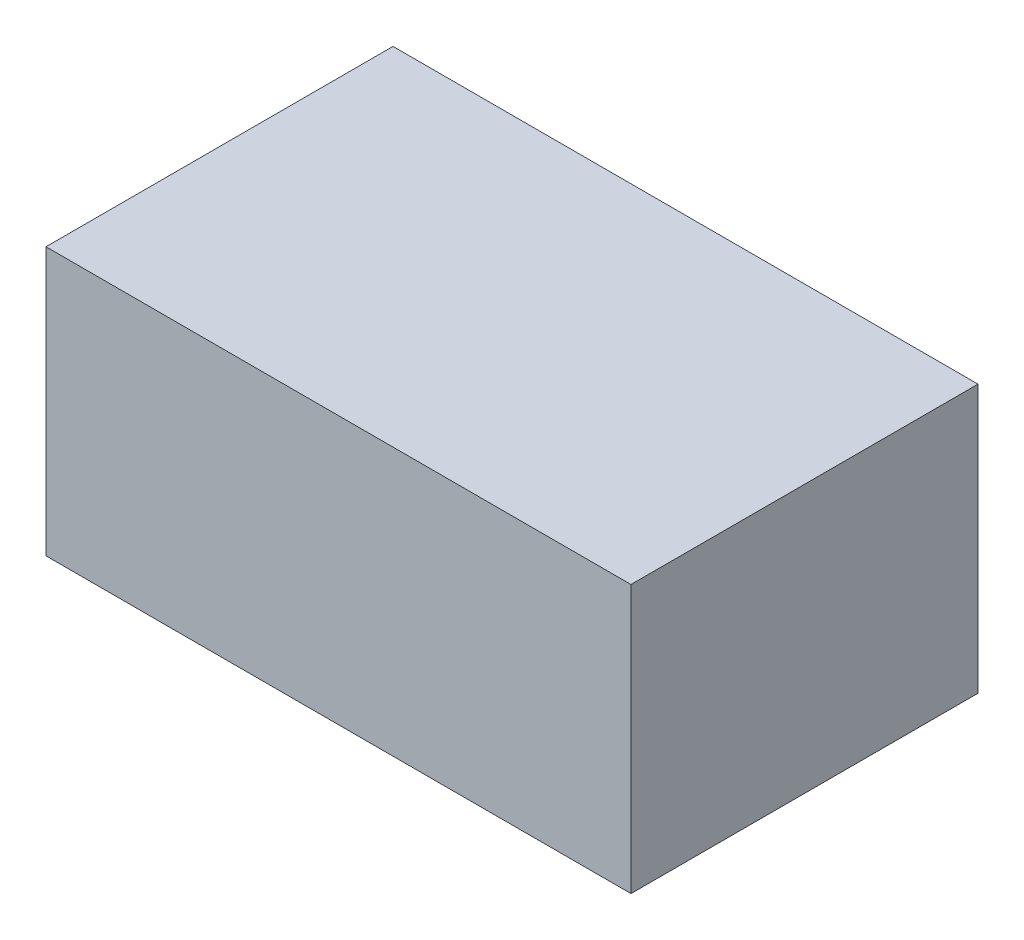
ISO-10303-21;
HEADER;
FILE_DESCRIPTION(('STEP AP214'),'2;1');
FILE_NAME('part.step','',(''),(''),'','','');
FILE_SCHEMA(('AUTOMOTIVE_DESIGN { 1 0 10303 214 1 1 1 1 }'));
ENDSEC;
DATA;
#1=APPLICATION_CONTEXT('core data for automotive mechanical design processes');
#2=APPLICATION_PROTOCOL_DEFINITION('international standard','automotive_design',2000,#1);
#3=PRODUCT_CONTEXT('',#1,'mechanical');
#4=PRODUCT('Part','Part','',(#3));
#5=PRODUCT_RELATED_PRODUCT_CATEGORY('part','',(#4));
#6=PRODUCT_DEFINITION_FORMATION('','',#4);
#7=PRODUCT_DEFINITION_CONTEXT('part definition',#1,'design');
#8=PRODUCT_DEFINITION('design','',#6,#7);
#9=PRODUCT_DEFINITION_SHAPE('','',#8);
#10=(LENGTH_UNIT() NAMED_UNIT(*) SI_UNIT(.MILLI.,.METRE.));
#11=(NAMED_UNIT(*) PLANE_ANGLE_UNIT() SI_UNIT($,.RADIAN.));
#12=(NAMED_UNIT(*) SI_UNIT($,.STERADIAN.) SOLID_ANGLE_UNIT());
#13=UNCERTAINTY_MEASURE_WITH_UNIT(LENGTH_MEASURE(1.E-05),#10,'distance_accuracy_value','');
#14=(GEOMETRIC_REPRESENTATION_CONTEXT(3) GLOBAL_UNCERTAINTY_ASSIGNED_CONTEXT((#13)) GLOBAL_UNIT_ASSIGNED_CONTEXT((#10,
#11,#12)) REPRESENTATION_CONTEXT('',''));
#15=CARTESIAN_POINT('',(0.,0.,0.));
#16=DIRECTION('',(0.,0.,1.));
#17=DIRECTION('',(1.,0.,0.));
#18=AXIS2_PLACEMENT_3D('',#15,#16,#17);
#19=CARTESIAN_POINT('',(29.5,13.5,35.));
#20=DIRECTION('',(-1.,0.,0.));
#21=DIRECTION('',(0.,-1.,0.));
#22=AXIS2_PLACEMENT_3D('',#19,#20,#21);
#23=PLANE('',#22);
#24=DIRECTION('',(0.,1.,0.));
#25=VECTOR('',#24,1.);
#26=CARTESIAN_POINT('',(29.5,13.5,0.));
#27=LINE('',#26,#25);
#28=CARTESIAN_POINT('',(29.5,-13.5,0.));
#29=VERTEX_POINT('',#28);
#30=CARTESIAN_POINT('',(29.5,13.5,0.));
#31=VERTEX_POINT('',#30);
#32=EDGE_CURVE('E110',#29,#31,#27,.T.);
#33=ORIENTED_EDGE('',*,*,#32,.T.);
#34=DIRECTION('',(0.,0.,-1.));
#35=VECTOR('',#34,1.);
#36=CARTESIAN_POINT('',(29.5,13.5,35.));
#37=LINE('',#36,#35);
#38=CARTESIAN_POINT('',(29.5,13.5,35.));
#39=VERTEX_POINT('',#38);
#40=EDGE_CURVE('E11',#39,#31,#37,.T.);
#41=ORIENTED_EDGE('',*,*,#40,.F.);
#42=DIRECTION('',(0.,1.,0.));
#43=VECTOR('',#42,1.);
#44=CARTESIAN_POINT('',(29.5,13.5,35.));
#45=LINE('',#44,#43);
#46=CARTESIAN_POINT('',(29.5,-13.5,35.));
#47=VERTEX_POINT('',#46);
#48=EDGE_CURVE('E94',#47,#39,#45,.T.);
#49=ORIENTED_EDGE('',*,*,#48,.F.);
#50=DIRECTION('',(0.,0.,-1.));
#51=VECTOR('',#50,1.);
#52=CARTESIAN_POINT('',(29.5,-13.5,35.));
#53=LINE('',#52,#51);
#54=EDGE_CURVE('E106',#47,#29,#53,.T.);
#55=ORIENTED_EDGE('',*,*,#54,.T.);
#56=EDGE_LOOP('',(#33,#41,#49,#55));
#57=FACE_BOUND('',#56,.T.);
#58=ADVANCED_FACE('F42',(#57),#23,.F.);
#59=CARTESIAN_POINT('',(-29.5,13.5,35.));
#60=DIRECTION('',(0.,-1.,0.));
#61=DIRECTION('',(0.,0.,-1.));
#62=AXIS2_PLACEMENT_3D('',#59,#60,#61);
#63=PLANE('',#62);
#64=DIRECTION('',(-1.,0.,0.));
#65=VECTOR('',#64,1.);
#66=CARTESIAN_POINT('',(-29.5,13.5,0.));
#67=LINE('',#66,#65);
#68=CARTESIAN_POINT('',(-29.5,13.5,0.));
#69=VERTEX_POINT('',#68);
#70=EDGE_CURVE('E99',#31,#69,#67,.T.);
#71=ORIENTED_EDGE('',*,*,#70,.T.);
#72=DIRECTION('',(0.,0.,-1.));
#73=VECTOR('',#72,1.);
#74=CARTESIAN_POINT('',(-29.5,13.5,35.));
#75=LINE('',#74,#73);
#76=CARTESIAN_POINT('',(-29.5,13.5,35.));
#77=VERTEX_POINT('',#76);
#78=EDGE_CURVE('E51',#77,#69,#75,.T.);
#79=ORIENTED_EDGE('',*,*,#78,.F.);
#80=DIRECTION('',(-1.,0.,0.));
#81=VECTOR('',#80,1.);
#82=CARTESIAN_POINT('',(-29.5,13.5,35.));
#83=LINE('',#82,#81);
#84=EDGE_CURVE('E89',#39,#77,#83,.T.);
#85=ORIENTED_EDGE('',*,*,#84,.F.);
#86=ORIENTED_EDGE('',*,*,#40,.T.);
#87=EDGE_LOOP('',(#71,#79,#85,#86));
#88=FACE_BOUND('',#87,.T.);
#89=ADVANCED_FACE('F98',(#88),#63,.F.);
#90=CARTESIAN_POINT('',(-29.5,13.5,35.));
#91=DIRECTION('',(1.,0.,0.));
#92=DIRECTION('',(0.,1.,0.));
#93=AXIS2_PLACEMENT_3D('',#90,#91,#92);
#94=PLANE('',#93);
#95=DIRECTION('',(0.,-1.,0.));
#96=VECTOR('',#95,1.);
#97=CARTESIAN_POINT('',(-29.5,13.5,0.));
#98=LINE('',#97,#96);
#99=CARTESIAN_POINT('',(-29.5,-13.5,0.));
#100=VERTEX_POINT('',#99);
#101=EDGE_CURVE('E76',#69,#100,#98,.T.);
#102=ORIENTED_EDGE('',*,*,#101,.T.);
#103=DIRECTION('',(0.,0.,-1.));
#104=VECTOR('',#103,1.);
#105=CARTESIAN_POINT('',(-29.5,-13.5,35.));
#106=LINE('',#105,#104);
#107=CARTESIAN_POINT('',(-29.5,-13.5,35.));
#108=VERTEX_POINT('',#107);
#109=EDGE_CURVE('E101',#108,#100,#106,.T.);
#110=ORIENTED_EDGE('',*,*,#109,.F.);
#111=DIRECTION('',(0.,-1.,0.));
#112=VECTOR('',#111,1.);
#113=CARTESIAN_POINT('',(-29.5,13.5,35.));
#114=LINE('',#113,#112);
#115=EDGE_CURVE('E92',#77,#108,#114,.T.);
#116=ORIENTED_EDGE('',*,*,#115,.F.);
#117=ORIENTED_EDGE('',*,*,#78,.T.);
#118=EDGE_LOOP('',(#102,#110,#116,#117));
#119=FACE_BOUND('',#118,.T.);
#120=ADVANCED_FACE('F102',(#119),#94,.F.);
#121=CARTESIAN_POINT('',(-29.5,-13.5,35.));
#122=DIRECTION('',(0.,1.,0.));
#123=DIRECTION('',(0.,0.,1.));
#124=AXIS2_PLACEMENT_3D('',#121,#122,#123);
#125=PLANE('',#124);
#126=DIRECTION('',(1.,0.,0.));
#127=VECTOR('',#126,1.);
#128=CARTESIAN_POINT('',(-29.5,-13.5,0.));
#129=LINE('',#128,#127);
#130=EDGE_CURVE('E82',#100,#29,#129,.T.);
#131=ORIENTED_EDGE('',*,*,#130,.T.);
#132=ORIENTED_EDGE('',*,*,#54,.F.);
#133=DIRECTION('',(1.,0.,0.));
#134=VECTOR('',#133,1.);
#135=CARTESIAN_POINT('',(-29.5,-13.5,35.));
#136=LINE('',#135,#134);
#137=EDGE_CURVE('E59',#108,#47,#136,.T.);
#138=ORIENTED_EDGE('',*,*,#137,.F.);
#139=ORIENTED_EDGE('',*,*,#109,.T.);
#140=EDGE_LOOP('',(#131,#132,#138,#139));
#141=FACE_BOUND('',#140,.T.);
#142=ADVANCED_FACE('F123',(#141),#125,.F.);
#143=CARTESIAN_POINT('',(29.5,-13.5,35.));
#144=DIRECTION('',(0.,0.,1.));
#145=DIRECTION('',(1.,0.,0.));
#146=AXIS2_PLACEMENT_3D('',#143,#144,#145);
#147=PLANE('',#146);
#148=ORIENTED_EDGE('',*,*,#48,.T.);
#149=ORIENTED_EDGE('',*,*,#84,.T.);
#150=ORIENTED_EDGE('',*,*,#115,.T.);
#151=ORIENTED_EDGE('',*,*,#137,.T.);
#152=EDGE_LOOP('',(#148,#149,#150,#151));
#153=FACE_BOUND('',#152,.T.);
#154=ADVANCED_FACE('F90',(#153),#147,.T.);
#155=CARTESIAN_POINT('',(29.5,-13.5,0.));
#156=DIRECTION('',(0.,0.,1.));
#157=DIRECTION('',(1.,0.,0.));
#158=AXIS2_PLACEMENT_3D('',#155,#156,#157);
#159=PLANE('',#158);
#160=ORIENTED_EDGE('',*,*,#32,.F.);
#161=ORIENTED_EDGE('',*,*,#130,.F.);
#162=ORIENTED_EDGE('',*,*,#101,.F.);
#163=ORIENTED_EDGE('',*,*,#70,.F.);
#164=EDGE_LOOP('',(#160,#161,#162,#163));
#165=FACE_BOUND('',#164,.T.);
#166=ADVANCED_FACE('F126',(#165),#159,.F.);
#167=CLOSED_SHELL('',(#58,#89,#120,#142,#154,#166));
#168=MANIFOLD_SOLID_BREP('B2',#167);
#169=ADVANCED_BREP_SHAPE_REPRESENTATION('',(#18,#168),#14);
#170=SHAPE_DEFINITION_REPRESENTATION(#9,#169);
ENDSEC;
END-ISO-10303-21;
